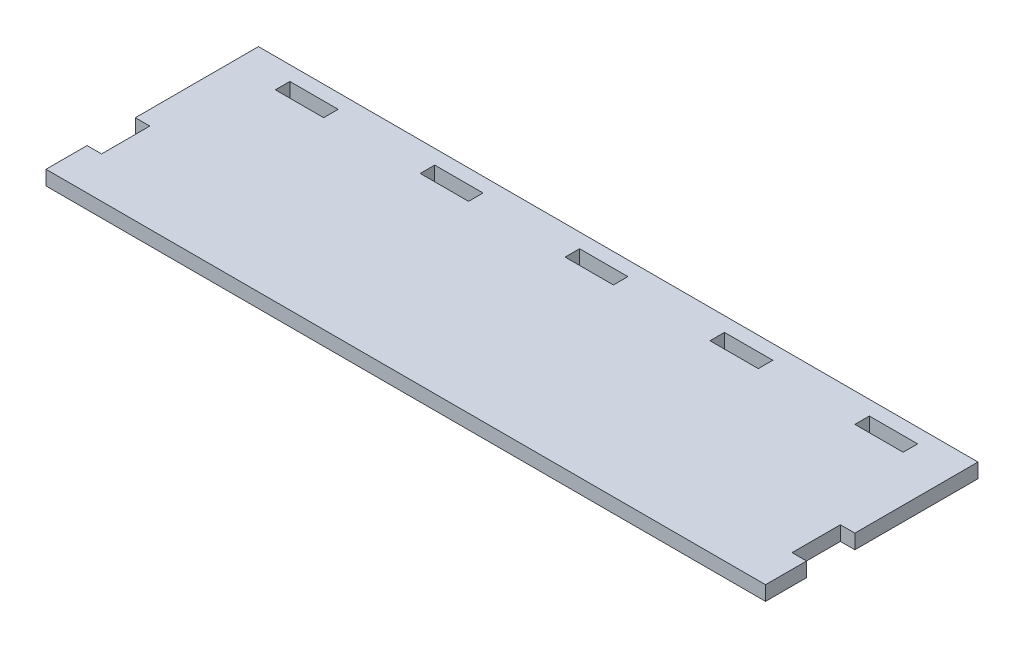
ISO-10303-21;
HEADER;
FILE_DESCRIPTION(('STEP AP214'),'2;1');
FILE_NAME('part.step','',(''),(''),'','','');
FILE_SCHEMA(('AUTOMOTIVE_DESIGN { 1 0 10303 214 1 1 1 1 }'));
ENDSEC;
DATA;
#1=APPLICATION_CONTEXT('core data for automotive mechanical design processes');
#2=APPLICATION_PROTOCOL_DEFINITION('international standard','automotive_design',2000,#1);
#3=PRODUCT_CONTEXT('',#1,'mechanical');
#4=PRODUCT('Part','Part','',(#3));
#5=PRODUCT_RELATED_PRODUCT_CATEGORY('part','',(#4));
#6=PRODUCT_DEFINITION_FORMATION('','',#4);
#7=PRODUCT_DEFINITION_CONTEXT('part definition',#1,'design');
#8=PRODUCT_DEFINITION('design','',#6,#7);
#9=PRODUCT_DEFINITION_SHAPE('','',#8);
#10=(LENGTH_UNIT() NAMED_UNIT(*) SI_UNIT(.MILLI.,.METRE.));
#11=(NAMED_UNIT(*) PLANE_ANGLE_UNIT() SI_UNIT($,.RADIAN.));
#12=(NAMED_UNIT(*) SI_UNIT($,.STERADIAN.) SOLID_ANGLE_UNIT());
#13=UNCERTAINTY_MEASURE_WITH_UNIT(LENGTH_MEASURE(1.E-05),#10,'distance_accuracy_value','');
#14=(GEOMETRIC_REPRESENTATION_CONTEXT(3) GLOBAL_UNCERTAINTY_ASSIGNED_CONTEXT((#13)) GLOBAL_UNIT_ASSIGNED_CONTEXT((#10,
#11,#12)) REPRESENTATION_CONTEXT('',''));
#15=CARTESIAN_POINT('',(0.,0.,0.));
#16=DIRECTION('',(0.,0.,1.));
#17=DIRECTION('',(1.,0.,0.));
#18=AXIS2_PLACEMENT_3D('',#15,#16,#17);
#19=CARTESIAN_POINT('',(0.,3.,0.));
#20=DIRECTION('',(0.,-1.,0.));
#21=DIRECTION('',(0.,0.,-1.));
#22=AXIS2_PLACEMENT_3D('',#19,#20,#21);
#23=PLANE('',#22);
#24=DIRECTION('',(0.,0.,1.));
#25=VECTOR('',#24,1.);
#26=CARTESIAN_POINT('',(55.,3.,-41.));
#27=LINE('',#26,#25);
#28=CARTESIAN_POINT('',(55.,3.,-41.));
#29=VERTEX_POINT('',#28);
#30=CARTESIAN_POINT('',(55.,3.,-38.));
#31=VERTEX_POINT('',#30);
#32=EDGE_CURVE('E278',#29,#31,#27,.T.);
#33=ORIENTED_EDGE('',*,*,#32,.F.);
#34=DIRECTION('',(-1.,0.,0.));
#35=VECTOR('',#34,1.);
#36=CARTESIAN_POINT('',(55.,3.,-41.));
#37=LINE('',#36,#35);
#38=CARTESIAN_POINT('',(65.,3.,-41.));
#39=VERTEX_POINT('',#38);
#40=EDGE_CURVE('E286',#39,#29,#37,.T.);
#41=ORIENTED_EDGE('',*,*,#40,.F.);
#42=DIRECTION('',(0.,0.,-1.));
#43=VECTOR('',#42,1.);
#44=CARTESIAN_POINT('',(65.,3.,-41.));
#45=LINE('',#44,#43);
#46=CARTESIAN_POINT('',(65.,3.,-38.));
#47=VERTEX_POINT('',#46);
#48=EDGE_CURVE('E283',#47,#39,#45,.T.);
#49=ORIENTED_EDGE('',*,*,#48,.F.);
#50=DIRECTION('',(1.,0.,0.));
#51=VECTOR('',#50,1.);
#52=CARTESIAN_POINT('',(55.,3.,-38.));
#53=LINE('',#52,#51);
#54=EDGE_CURVE('E280',#31,#47,#53,.T.);
#55=ORIENTED_EDGE('',*,*,#54,.F.);
#56=EDGE_LOOP('',(#33,#41,#49,#55));
#57=FACE_BOUND('',#56,.T.);
#58=DIRECTION('',(-1.,0.,0.));
#59=VECTOR('',#58,1.);
#60=CARTESIAN_POINT('',(-55.,3.,-41.));
#61=LINE('',#60,#59);
#62=CARTESIAN_POINT('',(-55.,3.,-41.));
#63=VERTEX_POINT('',#62);
#64=CARTESIAN_POINT('',(-65.,3.,-41.));
#65=VERTEX_POINT('',#64);
#66=EDGE_CURVE('E340',#63,#65,#61,.T.);
#67=ORIENTED_EDGE('',*,*,#66,.F.);
#68=DIRECTION('',(0.,0.,-1.));
#69=VECTOR('',#68,1.);
#70=CARTESIAN_POINT('',(-55.,3.,-41.));
#71=LINE('',#70,#69);
#72=CARTESIAN_POINT('',(-55.,3.,-38.));
#73=VERTEX_POINT('',#72);
#74=EDGE_CURVE('E348',#73,#63,#71,.T.);
#75=ORIENTED_EDGE('',*,*,#74,.F.);
#76=DIRECTION('',(1.,0.,0.));
#77=VECTOR('',#76,1.);
#78=CARTESIAN_POINT('',(-55.,3.,-38.));
#79=LINE('',#78,#77);
#80=CARTESIAN_POINT('',(-65.,3.,-38.));
#81=VERTEX_POINT('',#80);
#82=EDGE_CURVE('E345',#81,#73,#79,.T.);
#83=ORIENTED_EDGE('',*,*,#82,.F.);
#84=DIRECTION('',(0.,0.,1.));
#85=VECTOR('',#84,1.);
#86=CARTESIAN_POINT('',(-65.,3.,-41.));
#87=LINE('',#86,#85);
#88=EDGE_CURVE('E342',#65,#81,#87,.T.);
#89=ORIENTED_EDGE('',*,*,#88,.F.);
#90=EDGE_LOOP('',(#67,#75,#83,#89));
#91=FACE_BOUND('',#90,.T.);
#92=DIRECTION('',(0.,0.,1.));
#93=VECTOR('',#92,1.);
#94=CARTESIAN_POINT('',(-74.5,3.,-44.));
#95=LINE('',#94,#93);
#96=CARTESIAN_POINT('',(-74.5,3.,-44.));
#97=VERTEX_POINT('',#96);
#98=CARTESIAN_POINT('',(-74.5,3.,-18.5));
#99=VERTEX_POINT('',#98);
#100=EDGE_CURVE('E402',#97,#99,#95,.T.);
#101=ORIENTED_EDGE('',*,*,#100,.T.);
#102=DIRECTION('',(1.,0.,0.));
#103=VECTOR('',#102,1.);
#104=CARTESIAN_POINT('',(-71.5,3.,-18.5));
#105=LINE('',#104,#103);
#106=CARTESIAN_POINT('',(-71.5,3.,-18.5));
#107=VERTEX_POINT('',#106);
#108=EDGE_CURVE('E405',#99,#107,#105,.T.);
#109=ORIENTED_EDGE('',*,*,#108,.T.);
#110=DIRECTION('',(0.,0.,1.));
#111=VECTOR('',#110,1.);
#112=CARTESIAN_POINT('',(-71.5,3.,-18.5));
#113=LINE('',#112,#111);
#114=CARTESIAN_POINT('',(-71.5,3.,-8.5));
#115=VERTEX_POINT('',#114);
#116=EDGE_CURVE('E408',#107,#115,#113,.T.);
#117=ORIENTED_EDGE('',*,*,#116,.T.);
#118=DIRECTION('',(-1.,0.,0.));
#119=VECTOR('',#118,1.);
#120=CARTESIAN_POINT('',(-71.5,3.,-8.5));
#121=LINE('',#120,#119);
#122=CARTESIAN_POINT('',(-74.5,3.,-8.5));
#123=VERTEX_POINT('',#122);
#124=EDGE_CURVE('E410',#115,#123,#121,.T.);
#125=ORIENTED_EDGE('',*,*,#124,.T.);
#126=DIRECTION('',(0.,0.,1.));
#127=VECTOR('',#126,1.);
#128=CARTESIAN_POINT('',(-74.5,3.,-8.5));
#129=LINE('',#128,#127);
#130=CARTESIAN_POINT('',(-74.5,3.,0.));
#131=VERTEX_POINT('',#130);
#132=EDGE_CURVE('E412',#123,#131,#129,.T.);
#133=ORIENTED_EDGE('',*,*,#132,.T.);
#134=DIRECTION('',(1.,0.,0.));
#135=VECTOR('',#134,1.);
#136=CARTESIAN_POINT('',(-74.5,3.,0.));
#137=LINE('',#136,#135);
#138=CARTESIAN_POINT('',(74.5,3.,0.));
#139=VERTEX_POINT('',#138);
#140=EDGE_CURVE('E414',#131,#139,#137,.T.);
#141=ORIENTED_EDGE('',*,*,#140,.T.);
#142=DIRECTION('',(0.,0.,-1.));
#143=VECTOR('',#142,1.);
#144=CARTESIAN_POINT('',(74.5,3.,-8.5));
#145=LINE('',#144,#143);
#146=CARTESIAN_POINT('',(74.5,3.,-8.5));
#147=VERTEX_POINT('',#146);
#148=EDGE_CURVE('E416',#139,#147,#145,.T.);
#149=ORIENTED_EDGE('',*,*,#148,.T.);
#150=DIRECTION('',(-1.,0.,0.));
#151=VECTOR('',#150,1.);
#152=CARTESIAN_POINT('',(71.5,3.,-8.5));
#153=LINE('',#152,#151);
#154=CARTESIAN_POINT('',(71.5,3.,-8.5));
#155=VERTEX_POINT('',#154);
#156=EDGE_CURVE('E418',#147,#155,#153,.T.);
#157=ORIENTED_EDGE('',*,*,#156,.T.);
#158=DIRECTION('',(0.,0.,-1.));
#159=VECTOR('',#158,1.);
#160=CARTESIAN_POINT('',(71.5,3.,-18.5));
#161=LINE('',#160,#159);
#162=CARTESIAN_POINT('',(71.5,3.,-18.5));
#163=VERTEX_POINT('',#162);
#164=EDGE_CURVE('E420',#155,#163,#161,.T.);
#165=ORIENTED_EDGE('',*,*,#164,.T.);
#166=DIRECTION('',(1.,0.,0.));
#167=VECTOR('',#166,1.);
#168=CARTESIAN_POINT('',(71.5,3.,-18.5));
#169=LINE('',#168,#167);
#170=CARTESIAN_POINT('',(74.5,3.,-18.5));
#171=VERTEX_POINT('',#170);
#172=EDGE_CURVE('E422',#163,#171,#169,.T.);
#173=ORIENTED_EDGE('',*,*,#172,.T.);
#174=DIRECTION('',(0.,0.,-1.));
#175=VECTOR('',#174,1.);
#176=CARTESIAN_POINT('',(74.5,3.,-44.));
#177=LINE('',#176,#175);
#178=CARTESIAN_POINT('',(74.5,3.,-44.));
#179=VERTEX_POINT('',#178);
#180=EDGE_CURVE('E424',#171,#179,#177,.T.);
#181=ORIENTED_EDGE('',*,*,#180,.T.);
#182=DIRECTION('',(-1.,0.,0.));
#183=VECTOR('',#182,1.);
#184=CARTESIAN_POINT('',(-74.5,3.,-44.));
#185=LINE('',#184,#183);
#186=EDGE_CURVE('E426',#179,#97,#185,.T.);
#187=ORIENTED_EDGE('',*,*,#186,.T.);
#188=EDGE_LOOP('',(#101,#109,#117,#125,#133,#141,#149,#157,#165,#173,#181,#187));
#189=FACE_BOUND('',#188,.T.);
#190=DIRECTION('',(0.,0.,1.));
#191=VECTOR('',#190,1.);
#192=CARTESIAN_POINT('',(-5.,3.,-41.));
#193=LINE('',#192,#191);
#194=CARTESIAN_POINT('',(-5.,3.,-41.));
#195=VERTEX_POINT('',#194);
#196=CARTESIAN_POINT('',(-5.,3.,-38.));
#197=VERTEX_POINT('',#196);
#198=EDGE_CURVE('E371',#195,#197,#193,.T.);
#199=ORIENTED_EDGE('',*,*,#198,.F.);
#200=DIRECTION('',(-1.,0.,0.));
#201=VECTOR('',#200,1.);
#202=CARTESIAN_POINT('',(-5.,3.,-41.));
#203=LINE('',#202,#201);
#204=CARTESIAN_POINT('',(5.,3.,-41.));
#205=VERTEX_POINT('',#204);
#206=EDGE_CURVE('E379',#205,#195,#203,.T.);
#207=ORIENTED_EDGE('',*,*,#206,.F.);
#208=DIRECTION('',(0.,0.,-1.));
#209=VECTOR('',#208,1.);
#210=CARTESIAN_POINT('',(5.,3.,-41.));
#211=LINE('',#210,#209);
#212=CARTESIAN_POINT('',(5.,3.,-38.));
#213=VERTEX_POINT('',#212);
#214=EDGE_CURVE('E376',#213,#205,#211,.T.);
#215=ORIENTED_EDGE('',*,*,#214,.F.);
#216=DIRECTION('',(1.,0.,0.));
#217=VECTOR('',#216,1.);
#218=CARTESIAN_POINT('',(-5.,3.,-38.));
#219=LINE('',#218,#217);
#220=EDGE_CURVE('E373',#197,#213,#219,.T.);
#221=ORIENTED_EDGE('',*,*,#220,.F.);
#222=EDGE_LOOP('',(#199,#207,#215,#221));
#223=FACE_BOUND('',#222,.T.);
#224=DIRECTION('',(0.,0.,1.));
#225=VECTOR('',#224,1.);
#226=CARTESIAN_POINT('',(25.,3.,-41.));
#227=LINE('',#226,#225);
#228=CARTESIAN_POINT('',(25.,3.,-41.));
#229=VERTEX_POINT('',#228);
#230=CARTESIAN_POINT('',(25.,3.,-38.));
#231=VERTEX_POINT('',#230);
#232=EDGE_CURVE('E309',#229,#231,#227,.T.);
#233=ORIENTED_EDGE('',*,*,#232,.F.);
#234=DIRECTION('',(-1.,0.,0.));
#235=VECTOR('',#234,1.);
#236=CARTESIAN_POINT('',(25.,3.,-41.));
#237=LINE('',#236,#235);
#238=CARTESIAN_POINT('',(35.,3.,-41.));
#239=VERTEX_POINT('',#238);
#240=EDGE_CURVE('E317',#239,#229,#237,.T.);
#241=ORIENTED_EDGE('',*,*,#240,.F.);
#242=DIRECTION('',(0.,0.,-1.));
#243=VECTOR('',#242,1.);
#244=CARTESIAN_POINT('',(35.,3.,-41.));
#245=LINE('',#244,#243);
#246=CARTESIAN_POINT('',(35.,3.,-38.));
#247=VERTEX_POINT('',#246);
#248=EDGE_CURVE('E314',#247,#239,#245,.T.);
#249=ORIENTED_EDGE('',*,*,#248,.F.);
#250=DIRECTION('',(1.,0.,0.));
#251=VECTOR('',#250,1.);
#252=CARTESIAN_POINT('',(25.,3.,-38.));
#253=LINE('',#252,#251);
#254=EDGE_CURVE('E311',#231,#247,#253,.T.);
#255=ORIENTED_EDGE('',*,*,#254,.F.);
#256=EDGE_LOOP('',(#233,#241,#249,#255));
#257=FACE_BOUND('',#256,.T.);
#258=DIRECTION('',(-1.,0.,0.));
#259=VECTOR('',#258,1.);
#260=CARTESIAN_POINT('',(-25.,3.,-41.));
#261=LINE('',#260,#259);
#262=CARTESIAN_POINT('',(-25.,3.,-41.));
#263=VERTEX_POINT('',#262);
#264=CARTESIAN_POINT('',(-35.,3.,-41.));
#265=VERTEX_POINT('',#264);
#266=EDGE_CURVE('E242',#263,#265,#261,.T.);
#267=ORIENTED_EDGE('',*,*,#266,.F.);
#268=DIRECTION('',(0.,0.,-1.));
#269=VECTOR('',#268,1.);
#270=CARTESIAN_POINT('',(-25.,3.,-41.));
#271=LINE('',#270,#269);
#272=CARTESIAN_POINT('',(-25.,3.,-38.));
#273=VERTEX_POINT('',#272);
#274=EDGE_CURVE('E264',#273,#263,#271,.T.);
#275=ORIENTED_EDGE('',*,*,#274,.F.);
#276=DIRECTION('',(1.,0.,0.));
#277=VECTOR('',#276,1.);
#278=CARTESIAN_POINT('',(-25.,3.,-38.));
#279=LINE('',#278,#277);
#280=CARTESIAN_POINT('',(-35.,3.,-38.));
#281=VERTEX_POINT('',#280);
#282=EDGE_CURVE('E262',#281,#273,#279,.T.);
#283=ORIENTED_EDGE('',*,*,#282,.F.);
#284=DIRECTION('',(0.,0.,1.));
#285=VECTOR('',#284,1.);
#286=CARTESIAN_POINT('',(-35.,3.,-41.));
#287=LINE('',#286,#285);
#288=EDGE_CURVE('E250',#265,#281,#287,.T.);
#289=ORIENTED_EDGE('',*,*,#288,.F.);
#290=EDGE_LOOP('',(#267,#275,#283,#289));
#291=FACE_BOUND('',#290,.T.);
#292=ADVANCED_FACE('F33',(#57,#91,#189,#223,#257,#291),#23,.F.);
#293=CARTESIAN_POINT('',(0.,0.,0.));
#294=DIRECTION('',(0.,-1.,0.));
#295=DIRECTION('',(0.,0.,-1.));
#296=AXIS2_PLACEMENT_3D('',#293,#294,#295);
#297=PLANE('',#296);
#298=DIRECTION('',(0.,0.,1.));
#299=VECTOR('',#298,1.);
#300=CARTESIAN_POINT('',(-74.5,0.,-44.));
#301=LINE('',#300,#299);
#302=CARTESIAN_POINT('',(-74.5,0.,-44.));
#303=VERTEX_POINT('',#302);
#304=CARTESIAN_POINT('',(-74.5,0.,-18.5));
#305=VERTEX_POINT('',#304);
#306=EDGE_CURVE('E401',#303,#305,#301,.T.);
#307=ORIENTED_EDGE('',*,*,#306,.F.);
#308=DIRECTION('',(-1.,0.,0.));
#309=VECTOR('',#308,1.);
#310=CARTESIAN_POINT('',(-74.5,0.,-44.));
#311=LINE('',#310,#309);
#312=CARTESIAN_POINT('',(74.5,0.,-44.));
#313=VERTEX_POINT('',#312);
#314=EDGE_CURVE('E406',#313,#303,#311,.T.);
#315=ORIENTED_EDGE('',*,*,#314,.F.);
#316=DIRECTION('',(0.,0.,-1.));
#317=VECTOR('',#316,1.);
#318=CARTESIAN_POINT('',(74.5,0.,-44.));
#319=LINE('',#318,#317);
#320=CARTESIAN_POINT('',(74.5,0.,-18.5));
#321=VERTEX_POINT('',#320);
#322=EDGE_CURVE('E449',#321,#313,#319,.T.);
#323=ORIENTED_EDGE('',*,*,#322,.F.);
#324=DIRECTION('',(1.,0.,0.));
#325=VECTOR('',#324,1.);
#326=CARTESIAN_POINT('',(71.5,0.,-18.5));
#327=LINE('',#326,#325);
#328=CARTESIAN_POINT('',(71.5,0.,-18.5));
#329=VERTEX_POINT('',#328);
#330=EDGE_CURVE('E447',#329,#321,#327,.T.);
#331=ORIENTED_EDGE('',*,*,#330,.F.);
#332=DIRECTION('',(0.,0.,-1.));
#333=VECTOR('',#332,1.);
#334=CARTESIAN_POINT('',(71.5,0.,-18.5));
#335=LINE('',#334,#333);
#336=CARTESIAN_POINT('',(71.5,0.,-8.5));
#337=VERTEX_POINT('',#336);
#338=EDGE_CURVE('E445',#337,#329,#335,.T.);
#339=ORIENTED_EDGE('',*,*,#338,.F.);
#340=DIRECTION('',(-1.,0.,0.));
#341=VECTOR('',#340,1.);
#342=CARTESIAN_POINT('',(71.5,0.,-8.5));
#343=LINE('',#342,#341);
#344=CARTESIAN_POINT('',(74.5,0.,-8.5));
#345=VERTEX_POINT('',#344);
#346=EDGE_CURVE('E443',#345,#337,#343,.T.);
#347=ORIENTED_EDGE('',*,*,#346,.F.);
#348=DIRECTION('',(0.,0.,-1.));
#349=VECTOR('',#348,1.);
#350=CARTESIAN_POINT('',(74.5,0.,-8.5));
#351=LINE('',#350,#349);
#352=CARTESIAN_POINT('',(74.5,0.,0.));
#353=VERTEX_POINT('',#352);
#354=EDGE_CURVE('E441',#353,#345,#351,.T.);
#355=ORIENTED_EDGE('',*,*,#354,.F.);
#356=DIRECTION('',(1.,0.,0.));
#357=VECTOR('',#356,1.);
#358=CARTESIAN_POINT('',(-74.5,0.,0.));
#359=LINE('',#358,#357);
#360=CARTESIAN_POINT('',(-74.5,0.,0.));
#361=VERTEX_POINT('',#360);
#362=EDGE_CURVE('E439',#361,#353,#359,.T.);
#363=ORIENTED_EDGE('',*,*,#362,.F.);
#364=DIRECTION('',(0.,0.,1.));
#365=VECTOR('',#364,1.);
#366=CARTESIAN_POINT('',(-74.5,0.,-8.5));
#367=LINE('',#366,#365);
#368=CARTESIAN_POINT('',(-74.5,0.,-8.5));
#369=VERTEX_POINT('',#368);
#370=EDGE_CURVE('E437',#369,#361,#367,.T.);
#371=ORIENTED_EDGE('',*,*,#370,.F.);
#372=DIRECTION('',(-1.,0.,0.));
#373=VECTOR('',#372,1.);
#374=CARTESIAN_POINT('',(-71.5,0.,-8.5));
#375=LINE('',#374,#373);
#376=CARTESIAN_POINT('',(-71.5,0.,-8.5));
#377=VERTEX_POINT('',#376);
#378=EDGE_CURVE('E435',#377,#369,#375,.T.);
#379=ORIENTED_EDGE('',*,*,#378,.F.);
#380=DIRECTION('',(0.,0.,1.));
#381=VECTOR('',#380,1.);
#382=CARTESIAN_POINT('',(-71.5,0.,-18.5));
#383=LINE('',#382,#381);
#384=CARTESIAN_POINT('',(-71.5,0.,-18.5));
#385=VERTEX_POINT('',#384);
#386=EDGE_CURVE('E433',#385,#377,#383,.T.);
#387=ORIENTED_EDGE('',*,*,#386,.F.);
#388=DIRECTION('',(1.,0.,0.));
#389=VECTOR('',#388,1.);
#390=CARTESIAN_POINT('',(-71.5,0.,-18.5));
#391=LINE('',#390,#389);
#392=EDGE_CURVE('E431',#305,#385,#391,.T.);
#393=ORIENTED_EDGE('',*,*,#392,.F.);
#394=EDGE_LOOP('',(#307,#315,#323,#331,#339,#347,#355,#363,#371,#379,#387,#393));
#395=FACE_BOUND('',#394,.T.);
#396=DIRECTION('',(-1.,0.,0.));
#397=VECTOR('',#396,1.);
#398=CARTESIAN_POINT('',(-5.,0.,-41.));
#399=LINE('',#398,#397);
#400=CARTESIAN_POINT('',(5.,0.,-41.));
#401=VERTEX_POINT('',#400);
#402=CARTESIAN_POINT('',(-5.,0.,-41.));
#403=VERTEX_POINT('',#402);
#404=EDGE_CURVE('E374',#401,#403,#399,.T.);
#405=ORIENTED_EDGE('',*,*,#404,.T.);
#406=DIRECTION('',(0.,0.,1.));
#407=VECTOR('',#406,1.);
#408=CARTESIAN_POINT('',(-5.,0.,-41.));
#409=LINE('',#408,#407);
#410=CARTESIAN_POINT('',(-5.,0.,-38.));
#411=VERTEX_POINT('',#410);
#412=EDGE_CURVE('E370',#403,#411,#409,.T.);
#413=ORIENTED_EDGE('',*,*,#412,.T.);
#414=DIRECTION('',(1.,0.,0.));
#415=VECTOR('',#414,1.);
#416=CARTESIAN_POINT('',(-5.,0.,-38.));
#417=LINE('',#416,#415);
#418=CARTESIAN_POINT('',(5.,0.,-38.));
#419=VERTEX_POINT('',#418);
#420=EDGE_CURVE('E384',#411,#419,#417,.T.);
#421=ORIENTED_EDGE('',*,*,#420,.T.);
#422=DIRECTION('',(0.,0.,-1.));
#423=VECTOR('',#422,1.);
#424=CARTESIAN_POINT('',(5.,0.,-41.));
#425=LINE('',#424,#423);
#426=EDGE_CURVE('E387',#419,#401,#425,.T.);
#427=ORIENTED_EDGE('',*,*,#426,.T.);
#428=EDGE_LOOP('',(#405,#413,#421,#427));
#429=FACE_BOUND('',#428,.T.);
#430=DIRECTION('',(0.,0.,-1.));
#431=VECTOR('',#430,1.);
#432=CARTESIAN_POINT('',(-55.,0.,-41.));
#433=LINE('',#432,#431);
#434=CARTESIAN_POINT('',(-55.,0.,-38.));
#435=VERTEX_POINT('',#434);
#436=CARTESIAN_POINT('',(-55.,0.,-41.));
#437=VERTEX_POINT('',#436);
#438=EDGE_CURVE('E343',#435,#437,#433,.T.);
#439=ORIENTED_EDGE('',*,*,#438,.T.);
#440=DIRECTION('',(-1.,0.,0.));
#441=VECTOR('',#440,1.);
#442=CARTESIAN_POINT('',(-55.,0.,-41.));
#443=LINE('',#442,#441);
#444=CARTESIAN_POINT('',(-65.,0.,-41.));
#445=VERTEX_POINT('',#444);
#446=EDGE_CURVE('E339',#437,#445,#443,.T.);
#447=ORIENTED_EDGE('',*,*,#446,.T.);
#448=DIRECTION('',(0.,0.,1.));
#449=VECTOR('',#448,1.);
#450=CARTESIAN_POINT('',(-65.,0.,-41.));
#451=LINE('',#450,#449);
#452=CARTESIAN_POINT('',(-65.,0.,-38.));
#453=VERTEX_POINT('',#452);
#454=EDGE_CURVE('E353',#445,#453,#451,.T.);
#455=ORIENTED_EDGE('',*,*,#454,.T.);
#456=DIRECTION('',(1.,0.,0.));
#457=VECTOR('',#456,1.);
#458=CARTESIAN_POINT('',(-55.,0.,-38.));
#459=LINE('',#458,#457);
#460=EDGE_CURVE('E356',#453,#435,#459,.T.);
#461=ORIENTED_EDGE('',*,*,#460,.T.);
#462=EDGE_LOOP('',(#439,#447,#455,#461));
#463=FACE_BOUND('',#462,.T.);
#464=DIRECTION('',(-1.,0.,0.));
#465=VECTOR('',#464,1.);
#466=CARTESIAN_POINT('',(25.,0.,-41.));
#467=LINE('',#466,#465);
#468=CARTESIAN_POINT('',(35.,0.,-41.));
#469=VERTEX_POINT('',#468);
#470=CARTESIAN_POINT('',(25.,0.,-41.));
#471=VERTEX_POINT('',#470);
#472=EDGE_CURVE('E312',#469,#471,#467,.T.);
#473=ORIENTED_EDGE('',*,*,#472,.T.);
#474=DIRECTION('',(0.,0.,1.));
#475=VECTOR('',#474,1.);
#476=CARTESIAN_POINT('',(25.,0.,-41.));
#477=LINE('',#476,#475);
#478=CARTESIAN_POINT('',(25.,0.,-38.));
#479=VERTEX_POINT('',#478);
#480=EDGE_CURVE('E308',#471,#479,#477,.T.);
#481=ORIENTED_EDGE('',*,*,#480,.T.);
#482=DIRECTION('',(1.,0.,0.));
#483=VECTOR('',#482,1.);
#484=CARTESIAN_POINT('',(25.,0.,-38.));
#485=LINE('',#484,#483);
#486=CARTESIAN_POINT('',(35.,0.,-38.));
#487=VERTEX_POINT('',#486);
#488=EDGE_CURVE('E322',#479,#487,#485,.T.);
#489=ORIENTED_EDGE('',*,*,#488,.T.);
#490=DIRECTION('',(0.,0.,-1.));
#491=VECTOR('',#490,1.);
#492=CARTESIAN_POINT('',(35.,0.,-41.));
#493=LINE('',#492,#491);
#494=EDGE_CURVE('E325',#487,#469,#493,.T.);
#495=ORIENTED_EDGE('',*,*,#494,.T.);
#496=EDGE_LOOP('',(#473,#481,#489,#495));
#497=FACE_BOUND('',#496,.T.);
#498=DIRECTION('',(-1.,0.,0.));
#499=VECTOR('',#498,1.);
#500=CARTESIAN_POINT('',(55.,0.,-41.));
#501=LINE('',#500,#499);
#502=CARTESIAN_POINT('',(65.,0.,-41.));
#503=VERTEX_POINT('',#502);
#504=CARTESIAN_POINT('',(55.,0.,-41.));
#505=VERTEX_POINT('',#504);
#506=EDGE_CURVE('E281',#503,#505,#501,.T.);
#507=ORIENTED_EDGE('',*,*,#506,.T.);
#508=DIRECTION('',(0.,0.,1.));
#509=VECTOR('',#508,1.);
#510=CARTESIAN_POINT('',(55.,0.,-41.));
#511=LINE('',#510,#509);
#512=CARTESIAN_POINT('',(55.,0.,-38.));
#513=VERTEX_POINT('',#512);
#514=EDGE_CURVE('E258',#505,#513,#511,.T.);
#515=ORIENTED_EDGE('',*,*,#514,.T.);
#516=DIRECTION('',(1.,0.,0.));
#517=VECTOR('',#516,1.);
#518=CARTESIAN_POINT('',(55.,0.,-38.));
#519=LINE('',#518,#517);
#520=CARTESIAN_POINT('',(65.,0.,-38.));
#521=VERTEX_POINT('',#520);
#522=EDGE_CURVE('E291',#513,#521,#519,.T.);
#523=ORIENTED_EDGE('',*,*,#522,.T.);
#524=DIRECTION('',(0.,0.,-1.));
#525=VECTOR('',#524,1.);
#526=CARTESIAN_POINT('',(65.,0.,-41.));
#527=LINE('',#526,#525);
#528=EDGE_CURVE('E294',#521,#503,#527,.T.);
#529=ORIENTED_EDGE('',*,*,#528,.T.);
#530=EDGE_LOOP('',(#507,#515,#523,#529));
#531=FACE_BOUND('',#530,.T.);
#532=DIRECTION('',(0.,0.,-1.));
#533=VECTOR('',#532,1.);
#534=CARTESIAN_POINT('',(-25.,0.,-41.));
#535=LINE('',#534,#533);
#536=CARTESIAN_POINT('',(-25.,0.,-38.));
#537=VERTEX_POINT('',#536);
#538=CARTESIAN_POINT('',(-25.,0.,-41.));
#539=VERTEX_POINT('',#538);
#540=EDGE_CURVE('E251',#537,#539,#535,.T.);
#541=ORIENTED_EDGE('',*,*,#540,.T.);
#542=DIRECTION('',(-1.,0.,0.));
#543=VECTOR('',#542,1.);
#544=CARTESIAN_POINT('',(-25.,0.,-41.));
#545=LINE('',#544,#543);
#546=CARTESIAN_POINT('',(-35.,0.,-41.));
#547=VERTEX_POINT('',#546);
#548=EDGE_CURVE('E56',#539,#547,#545,.T.);
#549=ORIENTED_EDGE('',*,*,#548,.T.);
#550=DIRECTION('',(0.,0.,1.));
#551=VECTOR('',#550,1.);
#552=CARTESIAN_POINT('',(-35.,0.,-41.));
#553=LINE('',#552,#551);
#554=CARTESIAN_POINT('',(-35.,0.,-38.));
#555=VERTEX_POINT('',#554);
#556=EDGE_CURVE('E257',#547,#555,#553,.T.);
#557=ORIENTED_EDGE('',*,*,#556,.T.);
#558=DIRECTION('',(1.,0.,0.));
#559=VECTOR('',#558,1.);
#560=CARTESIAN_POINT('',(-25.,0.,-38.));
#561=LINE('',#560,#559);
#562=EDGE_CURVE('E270',#555,#537,#561,.T.);
#563=ORIENTED_EDGE('',*,*,#562,.T.);
#564=EDGE_LOOP('',(#541,#549,#557,#563));
#565=FACE_BOUND('',#564,.T.);
#566=ADVANCED_FACE('F491',(#395,#429,#463,#497,#531,#565),#297,.T.);
#567=CARTESIAN_POINT('',(-74.5,3.,-44.));
#568=DIRECTION('',(1.,0.,0.));
#569=DIRECTION('',(0.,0.,-1.));
#570=AXIS2_PLACEMENT_3D('',#567,#568,#569);
#571=PLANE('',#570);
#572=ORIENTED_EDGE('',*,*,#306,.T.);
#573=DIRECTION('',(0.,-1.,0.));
#574=VECTOR('',#573,1.);
#575=CARTESIAN_POINT('',(-74.5,3.,-18.5));
#576=LINE('',#575,#574);
#577=EDGE_CURVE('E11',#99,#305,#576,.T.);
#578=ORIENTED_EDGE('',*,*,#577,.F.);
#579=ORIENTED_EDGE('',*,*,#100,.F.);
#580=DIRECTION('',(0.,-1.,0.));
#581=VECTOR('',#580,1.);
#582=CARTESIAN_POINT('',(-74.5,3.,-44.));
#583=LINE('',#582,#581);
#584=EDGE_CURVE('E428',#97,#303,#583,.T.);
#585=ORIENTED_EDGE('',*,*,#584,.T.);
#586=EDGE_LOOP('',(#572,#578,#579,#585));
#587=FACE_BOUND('',#586,.T.);
#588=ADVANCED_FACE('F35',(#587),#571,.F.);
#589=CARTESIAN_POINT('',(-71.5,3.,-18.5));
#590=DIRECTION('',(0.,0.,-1.));
#591=DIRECTION('',(-1.,0.,0.));
#592=AXIS2_PLACEMENT_3D('',#589,#590,#591);
#593=PLANE('',#592);
#594=ORIENTED_EDGE('',*,*,#392,.T.);
#595=DIRECTION('',(0.,-1.,0.));
#596=VECTOR('',#595,1.);
#597=CARTESIAN_POINT('',(-71.5,3.,-18.5));
#598=LINE('',#597,#596);
#599=EDGE_CURVE('E41',#107,#385,#598,.T.);
#600=ORIENTED_EDGE('',*,*,#599,.F.);
#601=ORIENTED_EDGE('',*,*,#108,.F.);
#602=ORIENTED_EDGE('',*,*,#577,.T.);
#603=EDGE_LOOP('',(#594,#600,#601,#602));
#604=FACE_BOUND('',#603,.T.);
#605=ADVANCED_FACE('F509',(#604),#593,.F.);
#606=CARTESIAN_POINT('',(-71.5,3.,-18.5));
#607=DIRECTION('',(1.,0.,0.));
#608=DIRECTION('',(0.,0.,-1.));
#609=AXIS2_PLACEMENT_3D('',#606,#607,#608);
#610=PLANE('',#609);
#611=ORIENTED_EDGE('',*,*,#386,.T.);
#612=DIRECTION('',(0.,-1.,0.));
#613=VECTOR('',#612,1.);
#614=CARTESIAN_POINT('',(-71.5,3.,-8.5));
#615=LINE('',#614,#613);
#616=EDGE_CURVE('E478',#115,#377,#615,.T.);
#617=ORIENTED_EDGE('',*,*,#616,.F.);
#618=ORIENTED_EDGE('',*,*,#116,.F.);
#619=ORIENTED_EDGE('',*,*,#599,.T.);
#620=EDGE_LOOP('',(#611,#617,#618,#619));
#621=FACE_BOUND('',#620,.T.);
#622=ADVANCED_FACE('F485',(#621),#610,.F.);
#623=CARTESIAN_POINT('',(-71.5,3.,-8.5));
#624=DIRECTION('',(0.,0.,1.));
#625=DIRECTION('',(1.,0.,0.));
#626=AXIS2_PLACEMENT_3D('',#623,#624,#625);
#627=PLANE('',#626);
#628=ORIENTED_EDGE('',*,*,#378,.T.);
#629=DIRECTION('',(0.,-1.,0.));
#630=VECTOR('',#629,1.);
#631=CARTESIAN_POINT('',(-74.5,3.,-8.5));
#632=LINE('',#631,#630);
#633=EDGE_CURVE('E475',#123,#369,#632,.T.);
#634=ORIENTED_EDGE('',*,*,#633,.F.);
#635=ORIENTED_EDGE('',*,*,#124,.F.);
#636=ORIENTED_EDGE('',*,*,#616,.T.);
#637=EDGE_LOOP('',(#628,#634,#635,#636));
#638=FACE_BOUND('',#637,.T.);
#639=ADVANCED_FACE('F497',(#638),#627,.F.);
#640=CARTESIAN_POINT('',(-74.5,3.,-8.5));
#641=DIRECTION('',(1.,0.,0.));
#642=DIRECTION('',(0.,0.,-1.));
#643=AXIS2_PLACEMENT_3D('',#640,#641,#642);
#644=PLANE('',#643);
#645=ORIENTED_EDGE('',*,*,#370,.T.);
#646=DIRECTION('',(0.,-1.,0.));
#647=VECTOR('',#646,1.);
#648=CARTESIAN_POINT('',(-74.5,3.,0.));
#649=LINE('',#648,#647);
#650=EDGE_CURVE('E472',#131,#361,#649,.T.);
#651=ORIENTED_EDGE('',*,*,#650,.F.);
#652=ORIENTED_EDGE('',*,*,#132,.F.);
#653=ORIENTED_EDGE('',*,*,#633,.T.);
#654=EDGE_LOOP('',(#645,#651,#652,#653));
#655=FACE_BOUND('',#654,.T.);
#656=ADVANCED_FACE('F501',(#655),#644,.F.);
#657=CARTESIAN_POINT('',(-74.5,3.,0.));
#658=DIRECTION('',(0.,0.,-1.));
#659=DIRECTION('',(-1.,0.,0.));
#660=AXIS2_PLACEMENT_3D('',#657,#658,#659);
#661=PLANE('',#660);
#662=ORIENTED_EDGE('',*,*,#362,.T.);
#663=DIRECTION('',(0.,-1.,0.));
#664=VECTOR('',#663,1.);
#665=CARTESIAN_POINT('',(74.5,3.,0.));
#666=LINE('',#665,#664);
#667=EDGE_CURVE('E469',#139,#353,#666,.T.);
#668=ORIENTED_EDGE('',*,*,#667,.F.);
#669=ORIENTED_EDGE('',*,*,#140,.F.);
#670=ORIENTED_EDGE('',*,*,#650,.T.);
#671=EDGE_LOOP('',(#662,#668,#669,#670));
#672=FACE_BOUND('',#671,.T.);
#673=ADVANCED_FACE('F542',(#672),#661,.F.);
#674=CARTESIAN_POINT('',(74.5,3.,-8.5));
#675=DIRECTION('',(-1.,0.,0.));
#676=DIRECTION('',(0.,0.,1.));
#677=AXIS2_PLACEMENT_3D('',#674,#675,#676);
#678=PLANE('',#677);
#679=ORIENTED_EDGE('',*,*,#354,.T.);
#680=DIRECTION('',(0.,-1.,0.));
#681=VECTOR('',#680,1.);
#682=CARTESIAN_POINT('',(74.5,3.,-8.5));
#683=LINE('',#682,#681);
#684=EDGE_CURVE('E466',#147,#345,#683,.T.);
#685=ORIENTED_EDGE('',*,*,#684,.F.);
#686=ORIENTED_EDGE('',*,*,#148,.F.);
#687=ORIENTED_EDGE('',*,*,#667,.T.);
#688=EDGE_LOOP('',(#679,#685,#686,#687));
#689=FACE_BOUND('',#688,.T.);
#690=ADVANCED_FACE('F540',(#689),#678,.F.);
#691=CARTESIAN_POINT('',(71.5,3.,-8.5));
#692=DIRECTION('',(0.,0.,1.));
#693=DIRECTION('',(1.,0.,0.));
#694=AXIS2_PLACEMENT_3D('',#691,#692,#693);
#695=PLANE('',#694);
#696=ORIENTED_EDGE('',*,*,#346,.T.);
#697=DIRECTION('',(0.,-1.,0.));
#698=VECTOR('',#697,1.);
#699=CARTESIAN_POINT('',(71.5,3.,-8.5));
#700=LINE('',#699,#698);
#701=EDGE_CURVE('E463',#155,#337,#700,.T.);
#702=ORIENTED_EDGE('',*,*,#701,.F.);
#703=ORIENTED_EDGE('',*,*,#156,.F.);
#704=ORIENTED_EDGE('',*,*,#684,.T.);
#705=EDGE_LOOP('',(#696,#702,#703,#704));
#706=FACE_BOUND('',#705,.T.);
#707=ADVANCED_FACE('F536',(#706),#695,.F.);
#708=CARTESIAN_POINT('',(71.5,3.,-18.5));
#709=DIRECTION('',(-1.,0.,0.));
#710=DIRECTION('',(0.,0.,1.));
#711=AXIS2_PLACEMENT_3D('',#708,#709,#710);
#712=PLANE('',#711);
#713=ORIENTED_EDGE('',*,*,#338,.T.);
#714=DIRECTION('',(0.,-1.,0.));
#715=VECTOR('',#714,1.);
#716=CARTESIAN_POINT('',(71.5,3.,-18.5));
#717=LINE('',#716,#715);
#718=EDGE_CURVE('E460',#163,#329,#717,.T.);
#719=ORIENTED_EDGE('',*,*,#718,.F.);
#720=ORIENTED_EDGE('',*,*,#164,.F.);
#721=ORIENTED_EDGE('',*,*,#701,.T.);
#722=EDGE_LOOP('',(#713,#719,#720,#721));
#723=FACE_BOUND('',#722,.T.);
#724=ADVANCED_FACE('F531',(#723),#712,.F.);
#725=CARTESIAN_POINT('',(71.5,3.,-18.5));
#726=DIRECTION('',(0.,0.,-1.));
#727=DIRECTION('',(-1.,0.,0.));
#728=AXIS2_PLACEMENT_3D('',#725,#726,#727);
#729=PLANE('',#728);
#730=ORIENTED_EDGE('',*,*,#330,.T.);
#731=DIRECTION('',(0.,-1.,0.));
#732=VECTOR('',#731,1.);
#733=CARTESIAN_POINT('',(74.5,3.,-18.5));
#734=LINE('',#733,#732);
#735=EDGE_CURVE('E457',#171,#321,#734,.T.);
#736=ORIENTED_EDGE('',*,*,#735,.F.);
#737=ORIENTED_EDGE('',*,*,#172,.F.);
#738=ORIENTED_EDGE('',*,*,#718,.T.);
#739=EDGE_LOOP('',(#730,#736,#737,#738));
#740=FACE_BOUND('',#739,.T.);
#741=ADVANCED_FACE('F525',(#740),#729,.F.);
#742=CARTESIAN_POINT('',(74.5,3.,-44.));
#743=DIRECTION('',(-1.,0.,0.));
#744=DIRECTION('',(0.,0.,1.));
#745=AXIS2_PLACEMENT_3D('',#742,#743,#744);
#746=PLANE('',#745);
#747=ORIENTED_EDGE('',*,*,#322,.T.);
#748=DIRECTION('',(0.,-1.,0.));
#749=VECTOR('',#748,1.);
#750=CARTESIAN_POINT('',(74.5,3.,-44.));
#751=LINE('',#750,#749);
#752=EDGE_CURVE('E454',#179,#313,#751,.T.);
#753=ORIENTED_EDGE('',*,*,#752,.F.);
#754=ORIENTED_EDGE('',*,*,#180,.F.);
#755=ORIENTED_EDGE('',*,*,#735,.T.);
#756=EDGE_LOOP('',(#747,#753,#754,#755));
#757=FACE_BOUND('',#756,.T.);
#758=ADVANCED_FACE('F521',(#757),#746,.F.);
#759=CARTESIAN_POINT('',(-74.5,3.,-44.));
#760=DIRECTION('',(0.,0.,1.));
#761=DIRECTION('',(1.,0.,0.));
#762=AXIS2_PLACEMENT_3D('',#759,#760,#761);
#763=PLANE('',#762);
#764=ORIENTED_EDGE('',*,*,#314,.T.);
#765=ORIENTED_EDGE('',*,*,#584,.F.);
#766=ORIENTED_EDGE('',*,*,#186,.F.);
#767=ORIENTED_EDGE('',*,*,#752,.T.);
#768=EDGE_LOOP('',(#764,#765,#766,#767));
#769=FACE_BOUND('',#768,.T.);
#770=ADVANCED_FACE('F516',(#769),#763,.F.);
#771=CARTESIAN_POINT('',(-5.,3.,-41.));
#772=DIRECTION('',(1.,0.,0.));
#773=DIRECTION('',(0.,0.,-1.));
#774=AXIS2_PLACEMENT_3D('',#771,#772,#773);
#775=PLANE('',#774);
#776=ORIENTED_EDGE('',*,*,#412,.F.);
#777=DIRECTION('',(0.,-1.,0.));
#778=VECTOR('',#777,1.);
#779=CARTESIAN_POINT('',(-5.,3.,-41.));
#780=LINE('',#779,#778);
#781=EDGE_CURVE('E381',#195,#403,#780,.T.);
#782=ORIENTED_EDGE('',*,*,#781,.F.);
#783=ORIENTED_EDGE('',*,*,#198,.T.);
#784=DIRECTION('',(0.,-1.,0.));
#785=VECTOR('',#784,1.);
#786=CARTESIAN_POINT('',(-5.,3.,-38.));
#787=LINE('',#786,#785);
#788=EDGE_CURVE('E398',#197,#411,#787,.T.);
#789=ORIENTED_EDGE('',*,*,#788,.T.);
#790=EDGE_LOOP('',(#776,#782,#783,#789));
#791=FACE_BOUND('',#790,.T.);
#792=ADVANCED_FACE('F561',(#791),#775,.T.);
#793=CARTESIAN_POINT('',(-5.,3.,-38.));
#794=DIRECTION('',(0.,0.,-1.));
#795=DIRECTION('',(-1.,0.,0.));
#796=AXIS2_PLACEMENT_3D('',#793,#794,#795);
#797=PLANE('',#796);
#798=ORIENTED_EDGE('',*,*,#420,.F.);
#799=ORIENTED_EDGE('',*,*,#788,.F.);
#800=ORIENTED_EDGE('',*,*,#220,.T.);
#801=DIRECTION('',(0.,-1.,0.));
#802=VECTOR('',#801,1.);
#803=CARTESIAN_POINT('',(5.,3.,-38.));
#804=LINE('',#803,#802);
#805=EDGE_CURVE('E396',#213,#419,#804,.T.);
#806=ORIENTED_EDGE('',*,*,#805,.T.);
#807=EDGE_LOOP('',(#798,#799,#800,#806));
#808=FACE_BOUND('',#807,.T.);
#809=ADVANCED_FACE('F599',(#808),#797,.T.);
#810=CARTESIAN_POINT('',(5.,3.,-41.));
#811=DIRECTION('',(-1.,0.,0.));
#812=DIRECTION('',(0.,0.,1.));
#813=AXIS2_PLACEMENT_3D('',#810,#811,#812);
#814=PLANE('',#813);
#815=ORIENTED_EDGE('',*,*,#426,.F.);
#816=ORIENTED_EDGE('',*,*,#805,.F.);
#817=ORIENTED_EDGE('',*,*,#214,.T.);
#818=DIRECTION('',(0.,-1.,0.));
#819=VECTOR('',#818,1.);
#820=CARTESIAN_POINT('',(5.,3.,-41.));
#821=LINE('',#820,#819);
#822=EDGE_CURVE('E394',#205,#401,#821,.T.);
#823=ORIENTED_EDGE('',*,*,#822,.T.);
#824=EDGE_LOOP('',(#815,#816,#817,#823));
#825=FACE_BOUND('',#824,.T.);
#826=ADVANCED_FACE('F606',(#825),#814,.T.);
#827=CARTESIAN_POINT('',(-5.,3.,-41.));
#828=DIRECTION('',(0.,0.,1.));
#829=DIRECTION('',(1.,0.,0.));
#830=AXIS2_PLACEMENT_3D('',#827,#828,#829);
#831=PLANE('',#830);
#832=ORIENTED_EDGE('',*,*,#404,.F.);
#833=ORIENTED_EDGE('',*,*,#822,.F.);
#834=ORIENTED_EDGE('',*,*,#206,.T.);
#835=ORIENTED_EDGE('',*,*,#781,.T.);
#836=EDGE_LOOP('',(#832,#833,#834,#835));
#837=FACE_BOUND('',#836,.T.);
#838=ADVANCED_FACE('F613',(#837),#831,.T.);
#839=CARTESIAN_POINT('',(-55.,3.,-41.));
#840=DIRECTION('',(0.,0.,1.));
#841=DIRECTION('',(1.,0.,0.));
#842=AXIS2_PLACEMENT_3D('',#839,#840,#841);
#843=PLANE('',#842);
#844=ORIENTED_EDGE('',*,*,#446,.F.);
#845=DIRECTION('',(0.,-1.,0.));
#846=VECTOR('',#845,1.);
#847=CARTESIAN_POINT('',(-55.,3.,-41.));
#848=LINE('',#847,#846);
#849=EDGE_CURVE('E350',#63,#437,#848,.T.);
#850=ORIENTED_EDGE('',*,*,#849,.F.);
#851=ORIENTED_EDGE('',*,*,#66,.T.);
#852=DIRECTION('',(0.,-1.,0.));
#853=VECTOR('',#852,1.);
#854=CARTESIAN_POINT('',(-65.,3.,-41.));
#855=LINE('',#854,#853);
#856=EDGE_CURVE('E367',#65,#445,#855,.T.);
#857=ORIENTED_EDGE('',*,*,#856,.T.);
#858=EDGE_LOOP('',(#844,#850,#851,#857));
#859=FACE_BOUND('',#858,.T.);
#860=ADVANCED_FACE('F621',(#859),#843,.T.);
#861=CARTESIAN_POINT('',(-65.,3.,-41.));
#862=DIRECTION('',(1.,0.,0.));
#863=DIRECTION('',(0.,0.,-1.));
#864=AXIS2_PLACEMENT_3D('',#861,#862,#863);
#865=PLANE('',#864);
#866=ORIENTED_EDGE('',*,*,#454,.F.);
#867=ORIENTED_EDGE('',*,*,#856,.F.);
#868=ORIENTED_EDGE('',*,*,#88,.T.);
#869=DIRECTION('',(0.,-1.,0.));
#870=VECTOR('',#869,1.);
#871=CARTESIAN_POINT('',(-65.,3.,-38.));
#872=LINE('',#871,#870);
#873=EDGE_CURVE('E365',#81,#453,#872,.T.);
#874=ORIENTED_EDGE('',*,*,#873,.T.);
#875=EDGE_LOOP('',(#866,#867,#868,#874));
#876=FACE_BOUND('',#875,.T.);
#877=ADVANCED_FACE('F629',(#876),#865,.T.);
#878=CARTESIAN_POINT('',(-55.,3.,-38.));
#879=DIRECTION('',(0.,0.,-1.));
#880=DIRECTION('',(-1.,0.,0.));
#881=AXIS2_PLACEMENT_3D('',#878,#879,#880);
#882=PLANE('',#881);
#883=ORIENTED_EDGE('',*,*,#460,.F.);
#884=ORIENTED_EDGE('',*,*,#873,.F.);
#885=ORIENTED_EDGE('',*,*,#82,.T.);
#886=DIRECTION('',(0.,-1.,0.));
#887=VECTOR('',#886,1.);
#888=CARTESIAN_POINT('',(-55.,3.,-38.));
#889=LINE('',#888,#887);
#890=EDGE_CURVE('E363',#73,#435,#889,.T.);
#891=ORIENTED_EDGE('',*,*,#890,.T.);
#892=EDGE_LOOP('',(#883,#884,#885,#891));
#893=FACE_BOUND('',#892,.T.);
#894=ADVANCED_FACE('F637',(#893),#882,.T.);
#895=CARTESIAN_POINT('',(-55.,3.,-41.));
#896=DIRECTION('',(-1.,0.,0.));
#897=DIRECTION('',(0.,0.,1.));
#898=AXIS2_PLACEMENT_3D('',#895,#896,#897);
#899=PLANE('',#898);
#900=ORIENTED_EDGE('',*,*,#438,.F.);
#901=ORIENTED_EDGE('',*,*,#890,.F.);
#902=ORIENTED_EDGE('',*,*,#74,.T.);
#903=ORIENTED_EDGE('',*,*,#849,.T.);
#904=EDGE_LOOP('',(#900,#901,#902,#903));
#905=FACE_BOUND('',#904,.T.);
#906=ADVANCED_FACE('F645',(#905),#899,.T.);
#907=CARTESIAN_POINT('',(25.,3.,-41.));
#908=DIRECTION('',(1.,0.,0.));
#909=DIRECTION('',(0.,0.,-1.));
#910=AXIS2_PLACEMENT_3D('',#907,#908,#909);
#911=PLANE('',#910);
#912=ORIENTED_EDGE('',*,*,#480,.F.);
#913=DIRECTION('',(0.,-1.,0.));
#914=VECTOR('',#913,1.);
#915=CARTESIAN_POINT('',(25.,3.,-41.));
#916=LINE('',#915,#914);
#917=EDGE_CURVE('E319',#229,#471,#916,.T.);
#918=ORIENTED_EDGE('',*,*,#917,.F.);
#919=ORIENTED_EDGE('',*,*,#232,.T.);
#920=DIRECTION('',(0.,-1.,0.));
#921=VECTOR('',#920,1.);
#922=CARTESIAN_POINT('',(25.,3.,-38.));
#923=LINE('',#922,#921);
#924=EDGE_CURVE('E336',#231,#479,#923,.T.);
#925=ORIENTED_EDGE('',*,*,#924,.T.);
#926=EDGE_LOOP('',(#912,#918,#919,#925));
#927=FACE_BOUND('',#926,.T.);
#928=ADVANCED_FACE('F653',(#927),#911,.T.);
#929=CARTESIAN_POINT('',(25.,3.,-38.));
#930=DIRECTION('',(0.,0.,-1.));
#931=DIRECTION('',(-1.,0.,0.));
#932=AXIS2_PLACEMENT_3D('',#929,#930,#931);
#933=PLANE('',#932);
#934=ORIENTED_EDGE('',*,*,#488,.F.);
#935=ORIENTED_EDGE('',*,*,#924,.F.);
#936=ORIENTED_EDGE('',*,*,#254,.T.);
#937=DIRECTION('',(0.,-1.,0.));
#938=VECTOR('',#937,1.);
#939=CARTESIAN_POINT('',(35.,3.,-38.));
#940=LINE('',#939,#938);
#941=EDGE_CURVE('E334',#247,#487,#940,.T.);
#942=ORIENTED_EDGE('',*,*,#941,.T.);
#943=EDGE_LOOP('',(#934,#935,#936,#942));
#944=FACE_BOUND('',#943,.T.);
#945=ADVANCED_FACE('F661',(#944),#933,.T.);
#946=CARTESIAN_POINT('',(35.,3.,-41.));
#947=DIRECTION('',(-1.,0.,0.));
#948=DIRECTION('',(0.,0.,1.));
#949=AXIS2_PLACEMENT_3D('',#946,#947,#948);
#950=PLANE('',#949);
#951=ORIENTED_EDGE('',*,*,#494,.F.);
#952=ORIENTED_EDGE('',*,*,#941,.F.);
#953=ORIENTED_EDGE('',*,*,#248,.T.);
#954=DIRECTION('',(0.,-1.,0.));
#955=VECTOR('',#954,1.);
#956=CARTESIAN_POINT('',(35.,3.,-41.));
#957=LINE('',#956,#955);
#958=EDGE_CURVE('E332',#239,#469,#957,.T.);
#959=ORIENTED_EDGE('',*,*,#958,.T.);
#960=EDGE_LOOP('',(#951,#952,#953,#959));
#961=FACE_BOUND('',#960,.T.);
#962=ADVANCED_FACE('F669',(#961),#950,.T.);
#963=CARTESIAN_POINT('',(25.,3.,-41.));
#964=DIRECTION('',(0.,0.,1.));
#965=DIRECTION('',(1.,0.,0.));
#966=AXIS2_PLACEMENT_3D('',#963,#964,#965);
#967=PLANE('',#966);
#968=ORIENTED_EDGE('',*,*,#472,.F.);
#969=ORIENTED_EDGE('',*,*,#958,.F.);
#970=ORIENTED_EDGE('',*,*,#240,.T.);
#971=ORIENTED_EDGE('',*,*,#917,.T.);
#972=EDGE_LOOP('',(#968,#969,#970,#971));
#973=FACE_BOUND('',#972,.T.);
#974=ADVANCED_FACE('F677',(#973),#967,.T.);
#975=CARTESIAN_POINT('',(55.,3.,-41.));
#976=DIRECTION('',(1.,0.,0.));
#977=DIRECTION('',(0.,0.,-1.));
#978=AXIS2_PLACEMENT_3D('',#975,#976,#977);
#979=PLANE('',#978);
#980=ORIENTED_EDGE('',*,*,#514,.F.);
#981=DIRECTION('',(0.,-1.,0.));
#982=VECTOR('',#981,1.);
#983=CARTESIAN_POINT('',(55.,3.,-41.));
#984=LINE('',#983,#982);
#985=EDGE_CURVE('E288',#29,#505,#984,.T.);
#986=ORIENTED_EDGE('',*,*,#985,.F.);
#987=ORIENTED_EDGE('',*,*,#32,.T.);
#988=DIRECTION('',(0.,-1.,0.));
#989=VECTOR('',#988,1.);
#990=CARTESIAN_POINT('',(55.,3.,-38.));
#991=LINE('',#990,#989);
#992=EDGE_CURVE('E305',#31,#513,#991,.T.);
#993=ORIENTED_EDGE('',*,*,#992,.T.);
#994=EDGE_LOOP('',(#980,#986,#987,#993));
#995=FACE_BOUND('',#994,.T.);
#996=ADVANCED_FACE('F685',(#995),#979,.T.);
#997=CARTESIAN_POINT('',(55.,3.,-38.));
#998=DIRECTION('',(0.,0.,-1.));
#999=DIRECTION('',(-1.,0.,0.));
#1000=AXIS2_PLACEMENT_3D('',#997,#998,#999);
#1001=PLANE('',#1000);
#1002=ORIENTED_EDGE('',*,*,#522,.F.);
#1003=ORIENTED_EDGE('',*,*,#992,.F.);
#1004=ORIENTED_EDGE('',*,*,#54,.T.);
#1005=DIRECTION('',(0.,-1.,0.));
#1006=VECTOR('',#1005,1.);
#1007=CARTESIAN_POINT('',(65.,3.,-38.));
#1008=LINE('',#1007,#1006);
#1009=EDGE_CURVE('E303',#47,#521,#1008,.T.);
#1010=ORIENTED_EDGE('',*,*,#1009,.T.);
#1011=EDGE_LOOP('',(#1002,#1003,#1004,#1010));
#1012=FACE_BOUND('',#1011,.T.);
#1013=ADVANCED_FACE('F693',(#1012),#1001,.T.);
#1014=CARTESIAN_POINT('',(65.,3.,-41.));
#1015=DIRECTION('',(-1.,0.,0.));
#1016=DIRECTION('',(0.,0.,1.));
#1017=AXIS2_PLACEMENT_3D('',#1014,#1015,#1016);
#1018=PLANE('',#1017);
#1019=ORIENTED_EDGE('',*,*,#528,.F.);
#1020=ORIENTED_EDGE('',*,*,#1009,.F.);
#1021=ORIENTED_EDGE('',*,*,#48,.T.);
#1022=DIRECTION('',(0.,-1.,0.));
#1023=VECTOR('',#1022,1.);
#1024=CARTESIAN_POINT('',(65.,3.,-41.));
#1025=LINE('',#1024,#1023);
#1026=EDGE_CURVE('E301',#39,#503,#1025,.T.);
#1027=ORIENTED_EDGE('',*,*,#1026,.T.);
#1028=EDGE_LOOP('',(#1019,#1020,#1021,#1027));
#1029=FACE_BOUND('',#1028,.T.);
#1030=ADVANCED_FACE('F701',(#1029),#1018,.T.);
#1031=CARTESIAN_POINT('',(55.,3.,-41.));
#1032=DIRECTION('',(0.,0.,1.));
#1033=DIRECTION('',(1.,0.,0.));
#1034=AXIS2_PLACEMENT_3D('',#1031,#1032,#1033);
#1035=PLANE('',#1034);
#1036=ORIENTED_EDGE('',*,*,#506,.F.);
#1037=ORIENTED_EDGE('',*,*,#1026,.F.);
#1038=ORIENTED_EDGE('',*,*,#40,.T.);
#1039=ORIENTED_EDGE('',*,*,#985,.T.);
#1040=EDGE_LOOP('',(#1036,#1037,#1038,#1039));
#1041=FACE_BOUND('',#1040,.T.);
#1042=ADVANCED_FACE('F709',(#1041),#1035,.T.);
#1043=CARTESIAN_POINT('',(-25.,3.,-41.));
#1044=DIRECTION('',(0.,0.,1.));
#1045=DIRECTION('',(1.,0.,0.));
#1046=AXIS2_PLACEMENT_3D('',#1043,#1044,#1045);
#1047=PLANE('',#1046);
#1048=ORIENTED_EDGE('',*,*,#548,.F.);
#1049=DIRECTION('',(0.,-1.,0.));
#1050=VECTOR('',#1049,1.);
#1051=CARTESIAN_POINT('',(-25.,3.,-41.));
#1052=LINE('',#1051,#1050);
#1053=EDGE_CURVE('E246',#263,#539,#1052,.T.);
#1054=ORIENTED_EDGE('',*,*,#1053,.F.);
#1055=ORIENTED_EDGE('',*,*,#266,.T.);
#1056=DIRECTION('',(0.,-1.,0.));
#1057=VECTOR('',#1056,1.);
#1058=CARTESIAN_POINT('',(-35.,3.,-41.));
#1059=LINE('',#1058,#1057);
#1060=EDGE_CURVE('E245',#265,#547,#1059,.T.);
#1061=ORIENTED_EDGE('',*,*,#1060,.T.);
#1062=EDGE_LOOP('',(#1048,#1054,#1055,#1061));
#1063=FACE_BOUND('',#1062,.T.);
#1064=ADVANCED_FACE('F244',(#1063),#1047,.T.);
#1065=CARTESIAN_POINT('',(-35.,3.,-41.));
#1066=DIRECTION('',(1.,0.,0.));
#1067=DIRECTION('',(0.,0.,-1.));
#1068=AXIS2_PLACEMENT_3D('',#1065,#1066,#1067);
#1069=PLANE('',#1068);
#1070=ORIENTED_EDGE('',*,*,#556,.F.);
#1071=ORIENTED_EDGE('',*,*,#1060,.F.);
#1072=ORIENTED_EDGE('',*,*,#288,.T.);
#1073=DIRECTION('',(0.,-1.,0.));
#1074=VECTOR('',#1073,1.);
#1075=CARTESIAN_POINT('',(-35.,3.,-38.));
#1076=LINE('',#1075,#1074);
#1077=EDGE_CURVE('E259',#281,#555,#1076,.T.);
#1078=ORIENTED_EDGE('',*,*,#1077,.T.);
#1079=EDGE_LOOP('',(#1070,#1071,#1072,#1078));
#1080=FACE_BOUND('',#1079,.T.);
#1081=ADVANCED_FACE('F254',(#1080),#1069,.T.);
#1082=CARTESIAN_POINT('',(-25.,3.,-38.));
#1083=DIRECTION('',(0.,0.,-1.));
#1084=DIRECTION('',(-1.,0.,0.));
#1085=AXIS2_PLACEMENT_3D('',#1082,#1083,#1084);
#1086=PLANE('',#1085);
#1087=ORIENTED_EDGE('',*,*,#562,.F.);
#1088=ORIENTED_EDGE('',*,*,#1077,.F.);
#1089=ORIENTED_EDGE('',*,*,#282,.T.);
#1090=DIRECTION('',(0.,-1.,0.));
#1091=VECTOR('',#1090,1.);
#1092=CARTESIAN_POINT('',(-25.,3.,-38.));
#1093=LINE('',#1092,#1091);
#1094=EDGE_CURVE('E48',#273,#537,#1093,.T.);
#1095=ORIENTED_EDGE('',*,*,#1094,.T.);
#1096=EDGE_LOOP('',(#1087,#1088,#1089,#1095));
#1097=FACE_BOUND('',#1096,.T.);
#1098=ADVANCED_FACE('F730',(#1097),#1086,.T.);
#1099=CARTESIAN_POINT('',(-25.,3.,-41.));
#1100=DIRECTION('',(-1.,0.,0.));
#1101=DIRECTION('',(0.,0.,1.));
#1102=AXIS2_PLACEMENT_3D('',#1099,#1100,#1101);
#1103=PLANE('',#1102);
#1104=ORIENTED_EDGE('',*,*,#540,.F.);
#1105=ORIENTED_EDGE('',*,*,#1094,.F.);
#1106=ORIENTED_EDGE('',*,*,#274,.T.);
#1107=ORIENTED_EDGE('',*,*,#1053,.T.);
#1108=EDGE_LOOP('',(#1104,#1105,#1106,#1107));
#1109=FACE_BOUND('',#1108,.T.);
#1110=ADVANCED_FACE('F737',(#1109),#1103,.T.);
#1111=CLOSED_SHELL('',(#292,#566,#588,#605,#622,#639,#656,#673,#690,#707,#724,#741,#758,#770,
#792,#809,#826,#838,#860,#877,#894,#906,#928,#945,#962,#974,#996,#1013,#1030,#1042,#1064,#1081,
#1098,#1110));
#1112=MANIFOLD_SOLID_BREP('B2',#1111);
#1113=ADVANCED_BREP_SHAPE_REPRESENTATION('',(#18,#1112),#14);
#1114=SHAPE_DEFINITION_REPRESENTATION(#9,#1113);
ENDSEC;
END-ISO-10303-21;
